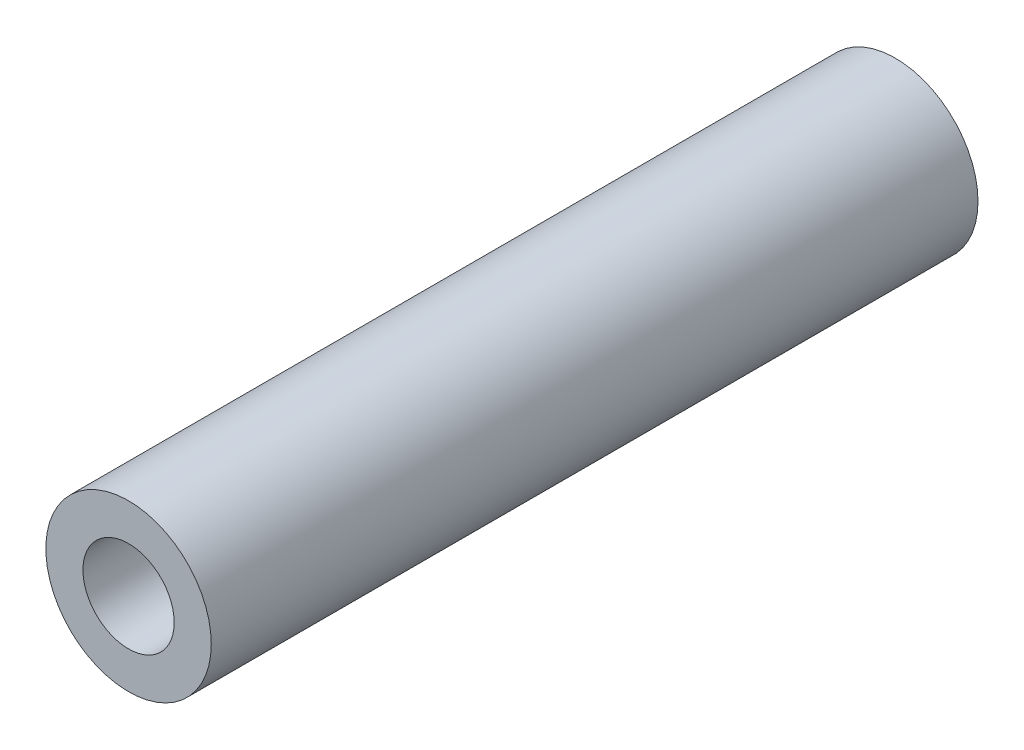
ISO-10303-21;
HEADER;
FILE_DESCRIPTION(('STEP AP214'),'2;1');
FILE_NAME('part.step','',(''),(''),'','','');
FILE_SCHEMA(('AUTOMOTIVE_DESIGN { 1 0 10303 214 1 1 1 1 }'));
ENDSEC;
DATA;
#1=APPLICATION_CONTEXT('core data for automotive mechanical design processes');
#2=APPLICATION_PROTOCOL_DEFINITION('international standard','automotive_design',2000,#1);
#3=PRODUCT_CONTEXT('',#1,'mechanical');
#4=PRODUCT('Part','Part','',(#3));
#5=PRODUCT_RELATED_PRODUCT_CATEGORY('part','',(#4));
#6=PRODUCT_DEFINITION_FORMATION('','',#4);
#7=PRODUCT_DEFINITION_CONTEXT('part definition',#1,'design');
#8=PRODUCT_DEFINITION('design','',#6,#7);
#9=PRODUCT_DEFINITION_SHAPE('','',#8);
#10=(LENGTH_UNIT() NAMED_UNIT(*) SI_UNIT(.MILLI.,.METRE.));
#11=(NAMED_UNIT(*) PLANE_ANGLE_UNIT() SI_UNIT($,.RADIAN.));
#12=(NAMED_UNIT(*) SI_UNIT($,.STERADIAN.) SOLID_ANGLE_UNIT());
#13=UNCERTAINTY_MEASURE_WITH_UNIT(LENGTH_MEASURE(1.E-05),#10,'distance_accuracy_value','');
#14=(GEOMETRIC_REPRESENTATION_CONTEXT(3) GLOBAL_UNCERTAINTY_ASSIGNED_CONTEXT((#13)) GLOBAL_UNIT_ASSIGNED_CONTEXT((#10,
#11,#12)) REPRESENTATION_CONTEXT('',''));
#15=CARTESIAN_POINT('',(0.,0.,0.));
#16=DIRECTION('',(0.,0.,1.));
#17=DIRECTION('',(1.,0.,0.));
#18=AXIS2_PLACEMENT_3D('',#15,#16,#17);
#19=CARTESIAN_POINT('',(0.,0.,12.7));
#20=DIRECTION('',(0.,0.,-1.));
#21=DIRECTION('',(-1.,0.,0.));
#22=AXIS2_PLACEMENT_3D('',#19,#20,#21);
#23=CYLINDRICAL_SURFACE('',#22,1.37);
#24=CARTESIAN_POINT('',(0.,0.,12.7));
#25=DIRECTION('',(0.,0.,1.));
#26=DIRECTION('',(1.,0.,0.));
#27=AXIS2_PLACEMENT_3D('',#24,#25,#26);
#28=CIRCLE('',#27,1.37);
#29=CARTESIAN_POINT('',(1.37,0.,12.7));
#30=VERTEX_POINT('',#29);
#31=EDGE_CURVE('E10',#30,#30,#28,.T.);
#32=ORIENTED_EDGE('',*,*,#31,.F.);
#33=EDGE_LOOP('',(#32));
#34=FACE_BOUND('',#33,.T.);
#35=CARTESIAN_POINT('',(0.,0.,0.));
#36=DIRECTION('',(0.,0.,1.));
#37=DIRECTION('',(1.,0.,0.));
#38=AXIS2_PLACEMENT_3D('',#35,#36,#37);
#39=CIRCLE('',#38,1.37);
#40=CARTESIAN_POINT('',(1.37,0.,0.));
#41=VERTEX_POINT('',#40);
#42=EDGE_CURVE('E18',#41,#41,#39,.T.);
#43=ORIENTED_EDGE('',*,*,#42,.T.);
#44=EDGE_LOOP('',(#43));
#45=FACE_BOUND('',#44,.T.);
#46=ADVANCED_FACE('F15',(#34,#45),#23,.T.);
#47=CARTESIAN_POINT('',(0.,0.,12.7));
#48=DIRECTION('',(0.,0.,1.));
#49=DIRECTION('',(1.,0.,0.));
#50=AXIS2_PLACEMENT_3D('',#47,#48,#49);
#51=PLANE('',#50);
#52=CARTESIAN_POINT('',(0.,0.,12.7));
#53=DIRECTION('',(0.,0.,1.));
#54=DIRECTION('',(1.,0.,0.));
#55=AXIS2_PLACEMENT_3D('',#52,#53,#54);
#56=CIRCLE('',#55,0.75565);
#57=CARTESIAN_POINT('',(0.75565,0.,12.7));
#58=VERTEX_POINT('',#57);
#59=EDGE_CURVE('E29',#58,#58,#56,.T.);
#60=ORIENTED_EDGE('',*,*,#59,.F.);
#61=EDGE_LOOP('',(#60));
#62=FACE_BOUND('',#61,.T.);
#63=ORIENTED_EDGE('',*,*,#31,.T.);
#64=EDGE_LOOP('',(#63));
#65=FACE_BOUND('',#64,.T.);
#66=ADVANCED_FACE('F35',(#62,#65),#51,.T.);
#67=CARTESIAN_POINT('',(0.,0.,0.));
#68=DIRECTION('',(0.,0.,1.));
#69=DIRECTION('',(1.,0.,0.));
#70=AXIS2_PLACEMENT_3D('',#67,#68,#69);
#71=PLANE('',#70);
#72=CARTESIAN_POINT('',(0.,0.,0.));
#73=DIRECTION('',(0.,0.,1.));
#74=DIRECTION('',(1.,0.,0.));
#75=AXIS2_PLACEMENT_3D('',#72,#73,#74);
#76=CIRCLE('',#75,0.75565);
#77=CARTESIAN_POINT('',(0.75565,0.,0.));
#78=VERTEX_POINT('',#77);
#79=EDGE_CURVE('E25',#78,#78,#76,.T.);
#80=ORIENTED_EDGE('',*,*,#79,.T.);
#81=EDGE_LOOP('',(#80));
#82=FACE_BOUND('',#81,.T.);
#83=ORIENTED_EDGE('',*,*,#42,.F.);
#84=EDGE_LOOP('',(#83));
#85=FACE_BOUND('',#84,.T.);
#86=ADVANCED_FACE('F37',(#82,#85),#71,.F.);
#87=CARTESIAN_POINT('',(0.,0.,12.7));
#88=DIRECTION('',(0.,0.,1.));
#89=DIRECTION('',(1.,0.,0.));
#90=AXIS2_PLACEMENT_3D('',#87,#88,#89);
#91=CYLINDRICAL_SURFACE('',#90,0.75565);
#92=ORIENTED_EDGE('',*,*,#79,.F.);
#93=EDGE_LOOP('',(#92));
#94=FACE_BOUND('',#93,.T.);
#95=ORIENTED_EDGE('',*,*,#59,.T.);
#96=EDGE_LOOP('',(#95));
#97=FACE_BOUND('',#96,.T.);
#98=ADVANCED_FACE('F33',(#94,#97),#91,.F.);
#99=CLOSED_SHELL('',(#46,#66,#86,#98));
#100=MANIFOLD_SOLID_BREP('B1',#99);
#101=ADVANCED_BREP_SHAPE_REPRESENTATION('',(#18,#100),#14);
#102=SHAPE_DEFINITION_REPRESENTATION(#9,#101);
ENDSEC;
END-ISO-10303-21;
